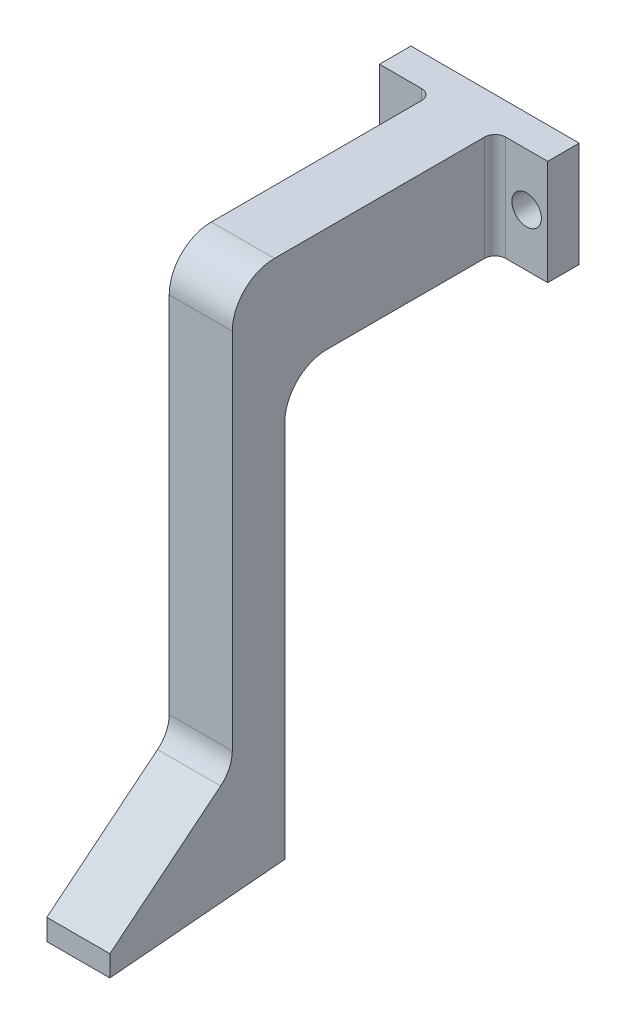
ISO-10303-21;
HEADER;
FILE_DESCRIPTION(('STEP AP214'),'2;1');
FILE_NAME('part.step','',(''),(''),'','','');
FILE_SCHEMA(('AUTOMOTIVE_DESIGN { 1 0 10303 214 1 1 1 1 }'));
ENDSEC;
DATA;
#1=APPLICATION_CONTEXT('core data for automotive mechanical design processes');
#2=APPLICATION_PROTOCOL_DEFINITION('international standard','automotive_design',2000,#1);
#3=PRODUCT_CONTEXT('',#1,'mechanical');
#4=PRODUCT('Part','Part','',(#3));
#5=PRODUCT_RELATED_PRODUCT_CATEGORY('part','',(#4));
#6=PRODUCT_DEFINITION_FORMATION('','',#4);
#7=PRODUCT_DEFINITION_CONTEXT('part definition',#1,'design');
#8=PRODUCT_DEFINITION('design','',#6,#7);
#9=PRODUCT_DEFINITION_SHAPE('','',#8);
#10=(LENGTH_UNIT() NAMED_UNIT(*) SI_UNIT(.MILLI.,.METRE.));
#11=(NAMED_UNIT(*) PLANE_ANGLE_UNIT() SI_UNIT($,.RADIAN.));
#12=(NAMED_UNIT(*) SI_UNIT($,.STERADIAN.) SOLID_ANGLE_UNIT());
#13=UNCERTAINTY_MEASURE_WITH_UNIT(LENGTH_MEASURE(1.E-05),#10,'distance_accuracy_value','');
#14=(GEOMETRIC_REPRESENTATION_CONTEXT(3) GLOBAL_UNCERTAINTY_ASSIGNED_CONTEXT((#13)) GLOBAL_UNIT_ASSIGNED_CONTEXT((#10,
#11,#12)) REPRESENTATION_CONTEXT('',''));
#15=CARTESIAN_POINT('',(0.,0.,0.));
#16=DIRECTION('',(0.,0.,1.));
#17=DIRECTION('',(1.,0.,0.));
#18=AXIS2_PLACEMENT_3D('',#15,#16,#17);
#19=CARTESIAN_POINT('',(0.,0.,3.81));
#20=DIRECTION('',(0.,0.,1.));
#21=DIRECTION('',(1.,0.,0.));
#22=AXIS2_PLACEMENT_3D('',#19,#20,#21);
#23=PLANE('',#22);
#24=DIRECTION('',(-1.,0.,0.));
#25=VECTOR('',#24,1.);
#26=CARTESIAN_POINT('',(-10.16,6.35,3.81));
#27=LINE('',#26,#25);
#28=CARTESIAN_POINT('',(10.16,6.35,3.81));
#29=VERTEX_POINT('',#28);
#30=CARTESIAN_POINT('',(5.08,6.35,3.81));
#31=VERTEX_POINT('',#30);
#32=EDGE_CURVE('E222',#29,#31,#27,.T.);
#33=ORIENTED_EDGE('',*,*,#32,.T.);
#34=DIRECTION('',(0.,1.,0.));
#35=VECTOR('',#34,1.);
#36=CARTESIAN_POINT('',(5.08,0.,3.81));
#37=LINE('',#36,#35);
#38=CARTESIAN_POINT('',(5.08,-6.35,3.81));
#39=VERTEX_POINT('',#38);
#40=EDGE_CURVE('E263',#31,#39,#37,.F.);
#41=ORIENTED_EDGE('',*,*,#40,.T.);
#42=DIRECTION('',(1.,0.,0.));
#43=VECTOR('',#42,1.);
#44=CARTESIAN_POINT('',(-10.16,-6.35,3.81));
#45=LINE('',#44,#43);
#46=CARTESIAN_POINT('',(10.16,-6.35,3.81));
#47=VERTEX_POINT('',#46);
#48=EDGE_CURVE('E227',#39,#47,#45,.T.);
#49=ORIENTED_EDGE('',*,*,#48,.T.);
#50=DIRECTION('',(0.,1.,0.));
#51=VECTOR('',#50,1.);
#52=CARTESIAN_POINT('',(10.16,6.35,3.81));
#53=LINE('',#52,#51);
#54=EDGE_CURVE('E217',#47,#29,#53,.T.);
#55=ORIENTED_EDGE('',*,*,#54,.T.);
#56=EDGE_LOOP('',(#33,#41,#49,#55));
#57=FACE_BOUND('',#56,.T.);
#58=CARTESIAN_POINT('',(7.62,0.,3.81));
#59=DIRECTION('',(0.,0.,1.));
#60=DIRECTION('',(1.,0.,0.));
#61=AXIS2_PLACEMENT_3D('',#58,#59,#60);
#62=CIRCLE('',#61,1.778);
#63=CARTESIAN_POINT('',(9.398,0.,3.81));
#64=VERTEX_POINT('',#63);
#65=EDGE_CURVE('E209',#64,#64,#62,.T.);
#66=ORIENTED_EDGE('',*,*,#65,.F.);
#67=EDGE_LOOP('',(#66));
#68=FACE_BOUND('',#67,.T.);
#69=ADVANCED_FACE('F32',(#57,#68),#23,.T.);
#70=CARTESIAN_POINT('',(10.16,6.35,3.81));
#71=DIRECTION('',(-1.,0.,0.));
#72=DIRECTION('',(0.,-1.,0.));
#73=AXIS2_PLACEMENT_3D('',#70,#71,#72);
#74=PLANE('',#73);
#75=DIRECTION('',(0.,1.,0.));
#76=VECTOR('',#75,1.);
#77=CARTESIAN_POINT('',(10.16,6.35,0.));
#78=LINE('',#77,#76);
#79=CARTESIAN_POINT('',(10.16,-6.35,0.));
#80=VERTEX_POINT('',#79);
#81=CARTESIAN_POINT('',(10.16,6.35,0.));
#82=VERTEX_POINT('',#81);
#83=EDGE_CURVE('E208',#80,#82,#78,.T.);
#84=ORIENTED_EDGE('',*,*,#83,.T.);
#85=DIRECTION('',(0.,0.,-1.));
#86=VECTOR('',#85,1.);
#87=CARTESIAN_POINT('',(10.16,6.35,3.81));
#88=LINE('',#87,#86);
#89=EDGE_CURVE('E247',#29,#82,#88,.T.);
#90=ORIENTED_EDGE('',*,*,#89,.F.);
#91=ORIENTED_EDGE('',*,*,#54,.F.);
#92=DIRECTION('',(0.,0.,-1.));
#93=VECTOR('',#92,1.);
#94=CARTESIAN_POINT('',(10.16,-6.35,3.81));
#95=LINE('',#94,#93);
#96=EDGE_CURVE('E231',#47,#80,#95,.T.);
#97=ORIENTED_EDGE('',*,*,#96,.T.);
#98=EDGE_LOOP('',(#84,#90,#91,#97));
#99=FACE_BOUND('',#98,.T.);
#100=ADVANCED_FACE('F308',(#99),#74,.F.);
#101=CARTESIAN_POINT('',(-10.16,6.35,3.81));
#102=DIRECTION('',(0.,-1.,0.));
#103=DIRECTION('',(0.,0.,-1.));
#104=AXIS2_PLACEMENT_3D('',#101,#102,#103);
#105=PLANE('',#104);
#106=DIRECTION('',(0.,0.,-1.));
#107=VECTOR('',#106,1.);
#108=CARTESIAN_POINT('',(-3.81,6.35,29.21));
#109=LINE('',#108,#107);
#110=CARTESIAN_POINT('',(-3.81,6.35,30.48));
#111=VERTEX_POINT('',#110);
#112=CARTESIAN_POINT('',(-3.81,6.35,5.08));
#113=VERTEX_POINT('',#112);
#114=EDGE_CURVE('E200',#111,#113,#109,.T.);
#115=ORIENTED_EDGE('',*,*,#114,.F.);
#116=DIRECTION('',(-1.,0.,0.));
#117=VECTOR('',#116,1.);
#118=CARTESIAN_POINT('',(3.81,6.35,30.48));
#119=LINE('',#118,#117);
#120=CARTESIAN_POINT('',(3.81,6.35,30.48));
#121=VERTEX_POINT('',#120);
#122=EDGE_CURVE('E282',#111,#121,#119,.F.);
#123=ORIENTED_EDGE('',*,*,#122,.T.);
#124=DIRECTION('',(0.,0.,-1.));
#125=VECTOR('',#124,1.);
#126=CARTESIAN_POINT('',(3.81,6.35,29.21));
#127=LINE('',#126,#125);
#128=CARTESIAN_POINT('',(3.81,6.35,5.08));
#129=VERTEX_POINT('',#128);
#130=EDGE_CURVE('E202',#121,#129,#127,.T.);
#131=ORIENTED_EDGE('',*,*,#130,.T.);
#132=CARTESIAN_POINT('',(5.08,6.35,5.08));
#133=DIRECTION('',(0.,-1.,0.));
#134=DIRECTION('',(0.,0.,-1.));
#135=AXIS2_PLACEMENT_3D('',#132,#133,#134);
#136=CIRCLE('',#135,1.27);
#137=EDGE_CURVE('E265',#129,#31,#136,.T.);
#138=ORIENTED_EDGE('',*,*,#137,.T.);
#139=ORIENTED_EDGE('',*,*,#32,.F.);
#140=ORIENTED_EDGE('',*,*,#89,.T.);
#141=DIRECTION('',(-1.,0.,0.));
#142=VECTOR('',#141,1.);
#143=CARTESIAN_POINT('',(-10.16,6.35,0.));
#144=LINE('',#143,#142);
#145=CARTESIAN_POINT('',(-10.16,6.35,0.));
#146=VERTEX_POINT('',#145);
#147=EDGE_CURVE('E234',#82,#146,#144,.T.);
#148=ORIENTED_EDGE('',*,*,#147,.T.);
#149=DIRECTION('',(0.,0.,-1.));
#150=VECTOR('',#149,1.);
#151=CARTESIAN_POINT('',(-10.16,6.35,3.81));
#152=LINE('',#151,#150);
#153=CARTESIAN_POINT('',(-10.16,6.35,3.81));
#154=VERTEX_POINT('',#153);
#155=EDGE_CURVE('E244',#154,#146,#152,.T.);
#156=ORIENTED_EDGE('',*,*,#155,.F.);
#157=CARTESIAN_POINT('',(-5.08,6.35,3.81));
#158=VERTEX_POINT('',#157);
#159=EDGE_CURVE('E220',#158,#154,#27,.T.);
#160=ORIENTED_EDGE('',*,*,#159,.F.);
#161=CARTESIAN_POINT('',(-5.08,6.35,5.08));
#162=DIRECTION('',(0.,-1.,0.));
#163=DIRECTION('',(0.,0.,-1.));
#164=AXIS2_PLACEMENT_3D('',#161,#162,#163);
#165=CIRCLE('',#164,1.27);
#166=EDGE_CURVE('E257',#158,#113,#165,.T.);
#167=ORIENTED_EDGE('',*,*,#166,.T.);
#168=EDGE_LOOP('',(#115,#123,#131,#138,#139,#140,#148,#156,#160,#167));
#169=FACE_BOUND('',#168,.T.);
#170=ADVANCED_FACE('F315',(#169),#105,.F.);
#171=CARTESIAN_POINT('',(-10.16,6.35,3.81));
#172=DIRECTION('',(1.,0.,0.));
#173=DIRECTION('',(0.,0.,-1.));
#174=AXIS2_PLACEMENT_3D('',#171,#172,#173);
#175=PLANE('',#174);
#176=DIRECTION('',(0.,-1.,0.));
#177=VECTOR('',#176,1.);
#178=CARTESIAN_POINT('',(-10.16,6.35,0.));
#179=LINE('',#178,#177);
#180=CARTESIAN_POINT('',(-10.16,-6.35,0.));
#181=VERTEX_POINT('',#180);
#182=EDGE_CURVE('E236',#146,#181,#179,.T.);
#183=ORIENTED_EDGE('',*,*,#182,.T.);
#184=DIRECTION('',(0.,0.,-1.));
#185=VECTOR('',#184,1.);
#186=CARTESIAN_POINT('',(-10.16,-6.35,3.81));
#187=LINE('',#186,#185);
#188=CARTESIAN_POINT('',(-10.16,-6.35,3.81));
#189=VERTEX_POINT('',#188);
#190=EDGE_CURVE('E241',#189,#181,#187,.T.);
#191=ORIENTED_EDGE('',*,*,#190,.F.);
#192=DIRECTION('',(0.,-1.,0.));
#193=VECTOR('',#192,1.);
#194=CARTESIAN_POINT('',(-10.16,6.35,3.81));
#195=LINE('',#194,#193);
#196=EDGE_CURVE('E225',#154,#189,#195,.T.);
#197=ORIENTED_EDGE('',*,*,#196,.F.);
#198=ORIENTED_EDGE('',*,*,#155,.T.);
#199=EDGE_LOOP('',(#183,#191,#197,#198));
#200=FACE_BOUND('',#199,.T.);
#201=ADVANCED_FACE('F331',(#200),#175,.F.);
#202=CARTESIAN_POINT('',(-10.16,-6.35,3.81));
#203=DIRECTION('',(0.,1.,0.));
#204=DIRECTION('',(0.,0.,1.));
#205=AXIS2_PLACEMENT_3D('',#202,#203,#204);
#206=PLANE('',#205);
#207=DIRECTION('',(0.,0.,-1.));
#208=VECTOR('',#207,1.);
#209=CARTESIAN_POINT('',(3.81,-6.35,29.21));
#210=LINE('',#209,#208);
#211=CARTESIAN_POINT('',(3.81,-6.35,24.13));
#212=VERTEX_POINT('',#211);
#213=CARTESIAN_POINT('',(3.81,-6.35,5.08));
#214=VERTEX_POINT('',#213);
#215=EDGE_CURVE('E195',#212,#214,#210,.T.);
#216=ORIENTED_EDGE('',*,*,#215,.F.);
#217=DIRECTION('',(1.,0.,0.));
#218=VECTOR('',#217,1.);
#219=CARTESIAN_POINT('',(-10.16,-6.35,24.13));
#220=LINE('',#219,#218);
#221=CARTESIAN_POINT('',(-3.81,-6.35,24.13));
#222=VERTEX_POINT('',#221);
#223=EDGE_CURVE('E271',#212,#222,#220,.F.);
#224=ORIENTED_EDGE('',*,*,#223,.T.);
#225=DIRECTION('',(0.,0.,-1.));
#226=VECTOR('',#225,1.);
#227=CARTESIAN_POINT('',(-3.81,-6.35,29.21));
#228=LINE('',#227,#226);
#229=CARTESIAN_POINT('',(-3.81,-6.35,5.08));
#230=VERTEX_POINT('',#229);
#231=EDGE_CURVE('E198',#222,#230,#228,.T.);
#232=ORIENTED_EDGE('',*,*,#231,.T.);
#233=CARTESIAN_POINT('',(-5.08,-6.35,5.08));
#234=DIRECTION('',(0.,1.,0.));
#235=DIRECTION('',(0.,0.,1.));
#236=AXIS2_PLACEMENT_3D('',#233,#234,#235);
#237=CIRCLE('',#236,1.27);
#238=CARTESIAN_POINT('',(-5.08,-6.35,3.81));
#239=VERTEX_POINT('',#238);
#240=EDGE_CURVE('E255',#230,#239,#237,.T.);
#241=ORIENTED_EDGE('',*,*,#240,.T.);
#242=EDGE_CURVE('E228',#189,#239,#45,.T.);
#243=ORIENTED_EDGE('',*,*,#242,.F.);
#244=ORIENTED_EDGE('',*,*,#190,.T.);
#245=DIRECTION('',(1.,0.,0.));
#246=VECTOR('',#245,1.);
#247=CARTESIAN_POINT('',(-10.16,-6.35,0.));
#248=LINE('',#247,#246);
#249=EDGE_CURVE('E221',#181,#80,#248,.T.);
#250=ORIENTED_EDGE('',*,*,#249,.T.);
#251=ORIENTED_EDGE('',*,*,#96,.F.);
#252=ORIENTED_EDGE('',*,*,#48,.F.);
#253=CARTESIAN_POINT('',(5.08,-6.35,5.08));
#254=DIRECTION('',(0.,1.,0.));
#255=DIRECTION('',(0.,0.,1.));
#256=AXIS2_PLACEMENT_3D('',#253,#254,#255);
#257=CIRCLE('',#256,1.27);
#258=EDGE_CURVE('E267',#39,#214,#257,.T.);
#259=ORIENTED_EDGE('',*,*,#258,.T.);
#260=EDGE_LOOP('',(#216,#224,#232,#241,#243,#244,#250,#251,#252,#259));
#261=FACE_BOUND('',#260,.T.);
#262=ADVANCED_FACE('F323',(#261),#206,.F.);
#263=ORIENTED_EDGE('',*,*,#242,.T.);
#264=DIRECTION('',(0.,-1.,0.));
#265=VECTOR('',#264,1.);
#266=CARTESIAN_POINT('',(-5.08,0.,3.81));
#267=LINE('',#266,#265);
#268=EDGE_CURVE('E253',#239,#158,#267,.F.);
#269=ORIENTED_EDGE('',*,*,#268,.T.);
#270=ORIENTED_EDGE('',*,*,#159,.T.);
#271=ORIENTED_EDGE('',*,*,#196,.T.);
#272=EDGE_LOOP('',(#263,#269,#270,#271));
#273=FACE_BOUND('',#272,.T.);
#274=CARTESIAN_POINT('',(-7.62,0.,3.81));
#275=DIRECTION('',(0.,0.,1.));
#276=DIRECTION('',(1.,0.,0.));
#277=AXIS2_PLACEMENT_3D('',#274,#275,#276);
#278=CIRCLE('',#277,1.778);
#279=CARTESIAN_POINT('',(-5.842,0.,3.81));
#280=VERTEX_POINT('',#279);
#281=EDGE_CURVE('E212',#280,#280,#278,.T.);
#282=ORIENTED_EDGE('',*,*,#281,.F.);
#283=EDGE_LOOP('',(#282));
#284=FACE_BOUND('',#283,.T.);
#285=ADVANCED_FACE('F311',(#273,#284),#23,.T.);
#286=CARTESIAN_POINT('',(0.,0.,0.));
#287=DIRECTION('',(0.,0.,1.));
#288=DIRECTION('',(1.,0.,0.));
#289=AXIS2_PLACEMENT_3D('',#286,#287,#288);
#290=PLANE('',#289);
#291=CARTESIAN_POINT('',(7.62,0.,0.));
#292=DIRECTION('',(0.,0.,1.));
#293=DIRECTION('',(1.,0.,0.));
#294=AXIS2_PLACEMENT_3D('',#291,#292,#293);
#295=CIRCLE('',#294,1.778);
#296=CARTESIAN_POINT('',(9.398,0.,0.));
#297=VERTEX_POINT('',#296);
#298=EDGE_CURVE('E205',#297,#297,#295,.T.);
#299=ORIENTED_EDGE('',*,*,#298,.T.);
#300=EDGE_LOOP('',(#299));
#301=FACE_BOUND('',#300,.T.);
#302=CARTESIAN_POINT('',(-7.62,0.,0.));
#303=DIRECTION('',(0.,0.,1.));
#304=DIRECTION('',(1.,0.,0.));
#305=AXIS2_PLACEMENT_3D('',#302,#303,#304);
#306=CIRCLE('',#305,1.778);
#307=CARTESIAN_POINT('',(-5.842,0.,0.));
#308=VERTEX_POINT('',#307);
#309=EDGE_CURVE('E204',#308,#308,#306,.T.);
#310=ORIENTED_EDGE('',*,*,#309,.T.);
#311=EDGE_LOOP('',(#310));
#312=FACE_BOUND('',#311,.T.);
#313=ORIENTED_EDGE('',*,*,#83,.F.);
#314=ORIENTED_EDGE('',*,*,#249,.F.);
#315=ORIENTED_EDGE('',*,*,#182,.F.);
#316=ORIENTED_EDGE('',*,*,#147,.F.);
#317=EDGE_LOOP('',(#313,#314,#315,#316));
#318=FACE_BOUND('',#317,.T.);
#319=ADVANCED_FACE('F322',(#301,#312,#318),#290,.F.);
#320=CARTESIAN_POINT('',(-7.62,0.,0.));
#321=DIRECTION('',(0.,0.,1.));
#322=DIRECTION('',(1.,0.,0.));
#323=AXIS2_PLACEMENT_3D('',#320,#321,#322);
#324=CYLINDRICAL_SURFACE('',#323,1.778);
#325=CARTESIAN_POINT('',(-5.842,0.,0.));
#326=CARTESIAN_POINT('',(-5.842,0.,0.0396874999999999));
#327=CARTESIAN_POINT('',(-5.842,0.,0.079375));
#328=CARTESIAN_POINT('',(-5.842,0.,0.15875));
#329=CARTESIAN_POINT('',(-5.842,0.,0.1984375));
#330=CARTESIAN_POINT('',(-5.842,0.,0.2778125));
#331=CARTESIAN_POINT('',(-5.842,0.,0.3175));
#332=CARTESIAN_POINT('',(-5.842,0.,0.396875));
#333=CARTESIAN_POINT('',(-5.842,0.,0.4365625));
#334=CARTESIAN_POINT('',(-5.842,0.,0.5159375));
#335=CARTESIAN_POINT('',(-5.842,0.,0.555625));
#336=CARTESIAN_POINT('',(-5.842,0.,0.635));
#337=CARTESIAN_POINT('',(-5.842,0.,0.6746875));
#338=CARTESIAN_POINT('',(-5.842,0.,0.7540625));
#339=CARTESIAN_POINT('',(-5.842,0.,0.79375));
#340=CARTESIAN_POINT('',(-5.842,0.,0.873125));
#341=CARTESIAN_POINT('',(-5.842,0.,0.9128125));
#342=CARTESIAN_POINT('',(-5.842,0.,0.9921875));
#343=CARTESIAN_POINT('',(-5.842,0.,1.031875));
#344=CARTESIAN_POINT('',(-5.842,0.,1.11125));
#345=CARTESIAN_POINT('',(-5.842,0.,1.1509375));
#346=CARTESIAN_POINT('',(-5.842,0.,1.2303125));
#347=CARTESIAN_POINT('',(-5.842,0.,1.27));
#348=CARTESIAN_POINT('',(-5.842,0.,1.349375));
#349=CARTESIAN_POINT('',(-5.842,0.,1.3890625));
#350=CARTESIAN_POINT('',(-5.842,0.,1.4684375));
#351=CARTESIAN_POINT('',(-5.842,0.,1.508125));
#352=CARTESIAN_POINT('',(-5.842,0.,1.5875));
#353=CARTESIAN_POINT('',(-5.842,0.,1.6271875));
#354=CARTESIAN_POINT('',(-5.842,0.,1.7065625));
#355=CARTESIAN_POINT('',(-5.842,0.,1.74625));
#356=CARTESIAN_POINT('',(-5.842,0.,1.825625));
#357=CARTESIAN_POINT('',(-5.842,0.,1.8653125));
#358=CARTESIAN_POINT('',(-5.842,0.,1.9446875));
#359=CARTESIAN_POINT('',(-5.842,0.,1.984375));
#360=CARTESIAN_POINT('',(-5.842,0.,2.06375));
#361=CARTESIAN_POINT('',(-5.842,0.,2.1034375));
#362=CARTESIAN_POINT('',(-5.842,0.,2.1828125));
#363=CARTESIAN_POINT('',(-5.842,0.,2.2225));
#364=CARTESIAN_POINT('',(-5.842,0.,2.301875));
#365=CARTESIAN_POINT('',(-5.842,0.,2.3415625));
#366=CARTESIAN_POINT('',(-5.842,0.,2.4209375));
#367=CARTESIAN_POINT('',(-5.842,0.,2.460625));
#368=CARTESIAN_POINT('',(-5.842,0.,2.54));
#369=CARTESIAN_POINT('',(-5.842,0.,2.5796875));
#370=CARTESIAN_POINT('',(-5.842,0.,2.6590625));
#371=CARTESIAN_POINT('',(-5.842,0.,2.69875));
#372=CARTESIAN_POINT('',(-5.842,0.,2.778125));
#373=CARTESIAN_POINT('',(-5.842,0.,2.8178125));
#374=CARTESIAN_POINT('',(-5.842,0.,2.8971875));
#375=CARTESIAN_POINT('',(-5.842,0.,2.936875));
#376=CARTESIAN_POINT('',(-5.842,0.,3.01625));
#377=CARTESIAN_POINT('',(-5.842,0.,3.0559375));
#378=CARTESIAN_POINT('',(-5.842,0.,3.1353125));
#379=CARTESIAN_POINT('',(-5.842,0.,3.175));
#380=CARTESIAN_POINT('',(-5.842,0.,3.254375));
#381=CARTESIAN_POINT('',(-5.842,0.,3.2940625));
#382=CARTESIAN_POINT('',(-5.842,0.,3.3734375));
#383=CARTESIAN_POINT('',(-5.842,0.,3.413125));
#384=CARTESIAN_POINT('',(-5.842,0.,3.4925));
#385=CARTESIAN_POINT('',(-5.842,0.,3.5321875));
#386=CARTESIAN_POINT('',(-5.842,0.,3.6115625));
#387=CARTESIAN_POINT('',(-5.842,0.,3.65125));
#388=CARTESIAN_POINT('',(-5.842,0.,3.730625));
#389=CARTESIAN_POINT('',(-5.842,0.,3.7703125));
#390=CARTESIAN_POINT('',(-5.842,0.,3.81));
#391=B_SPLINE_CURVE_WITH_KNOTS('',3,(#325,#326,#327,#328,#329,#330,#331,#332,#333,#334,#335,
#336,#337,#338,#339,#340,#341,#342,#343,#344,#345,#346,#347,#348,#349,#350,#351,#352,#353,#354,
#355,#356,#357,#358,#359,#360,#361,#362,#363,#364,#365,#366,#367,#368,#369,#370,#371,#372,#373,
#374,#375,#376,#377,#378,#379,#380,#381,#382,#383,#384,#385,#386,#387,#388,#389,#390),
.UNSPECIFIED.,.F.,.F.,(4,2,2,2,2,2,2,2,2,2,2,2,2,2,2,2,2,2,2,2,2,2,2,2,2,2,2,2,2,2,2,2,4),(0.,
0.1190625,0.238125,0.3571875,0.47625,0.5953125,0.714375,0.8334375,0.9525,1.0715625,1.190625,
1.3096875,1.42875,1.5478125,1.666875,1.7859375,1.905,2.0240625,2.143125,2.2621875,2.38125,
2.5003125,2.619375,2.7384375,2.8575,2.9765625,3.095625,3.2146875,3.33375,3.4528125,3.571875,
3.6909375,3.81),.UNSPECIFIED.);
#392=EDGE_CURVE('BSEAM329',#308,#280,#391,.T.);
#393=ORIENTED_EDGE('',*,*,#309,.F.);
#394=ORIENTED_EDGE('',*,*,#281,.T.);
#395=ORIENTED_EDGE('',*,*,#392,.T.);
#396=ORIENTED_EDGE('',*,*,#392,.F.);
#397=EDGE_LOOP('',(#393,#395,#394,#396));
#398=FACE_BOUND('',#397,.T.);
#399=ADVANCED_FACE('F329',(#398),#324,.F.);
#400=CARTESIAN_POINT('',(7.62,0.,0.));
#401=DIRECTION('',(0.,0.,1.));
#402=DIRECTION('',(1.,0.,0.));
#403=AXIS2_PLACEMENT_3D('',#400,#401,#402);
#404=CYLINDRICAL_SURFACE('',#403,1.778);
#405=CARTESIAN_POINT('',(9.398,0.,0.));
#406=CARTESIAN_POINT('',(9.398,0.,0.0396874999999999));
#407=CARTESIAN_POINT('',(9.398,0.,0.079375));
#408=CARTESIAN_POINT('',(9.398,0.,0.15875));
#409=CARTESIAN_POINT('',(9.398,0.,0.1984375));
#410=CARTESIAN_POINT('',(9.398,0.,0.2778125));
#411=CARTESIAN_POINT('',(9.398,0.,0.3175));
#412=CARTESIAN_POINT('',(9.398,0.,0.396875));
#413=CARTESIAN_POINT('',(9.398,0.,0.4365625));
#414=CARTESIAN_POINT('',(9.398,0.,0.5159375));
#415=CARTESIAN_POINT('',(9.398,0.,0.555625));
#416=CARTESIAN_POINT('',(9.398,0.,0.635));
#417=CARTESIAN_POINT('',(9.398,0.,0.6746875));
#418=CARTESIAN_POINT('',(9.398,0.,0.7540625));
#419=CARTESIAN_POINT('',(9.398,0.,0.79375));
#420=CARTESIAN_POINT('',(9.398,0.,0.873125));
#421=CARTESIAN_POINT('',(9.398,0.,0.9128125));
#422=CARTESIAN_POINT('',(9.398,0.,0.9921875));
#423=CARTESIAN_POINT('',(9.398,0.,1.031875));
#424=CARTESIAN_POINT('',(9.398,0.,1.11125));
#425=CARTESIAN_POINT('',(9.398,0.,1.1509375));
#426=CARTESIAN_POINT('',(9.398,0.,1.2303125));
#427=CARTESIAN_POINT('',(9.398,0.,1.27));
#428=CARTESIAN_POINT('',(9.398,0.,1.349375));
#429=CARTESIAN_POINT('',(9.398,0.,1.3890625));
#430=CARTESIAN_POINT('',(9.398,0.,1.4684375));
#431=CARTESIAN_POINT('',(9.398,0.,1.508125));
#432=CARTESIAN_POINT('',(9.398,0.,1.5875));
#433=CARTESIAN_POINT('',(9.398,0.,1.6271875));
#434=CARTESIAN_POINT('',(9.398,0.,1.7065625));
#435=CARTESIAN_POINT('',(9.398,0.,1.74625));
#436=CARTESIAN_POINT('',(9.398,0.,1.825625));
#437=CARTESIAN_POINT('',(9.398,0.,1.8653125));
#438=CARTESIAN_POINT('',(9.398,0.,1.9446875));
#439=CARTESIAN_POINT('',(9.398,0.,1.984375));
#440=CARTESIAN_POINT('',(9.398,0.,2.06375));
#441=CARTESIAN_POINT('',(9.398,0.,2.1034375));
#442=CARTESIAN_POINT('',(9.398,0.,2.1828125));
#443=CARTESIAN_POINT('',(9.398,0.,2.2225));
#444=CARTESIAN_POINT('',(9.398,0.,2.301875));
#445=CARTESIAN_POINT('',(9.398,0.,2.3415625));
#446=CARTESIAN_POINT('',(9.398,0.,2.4209375));
#447=CARTESIAN_POINT('',(9.398,0.,2.460625));
#448=CARTESIAN_POINT('',(9.398,0.,2.54));
#449=CARTESIAN_POINT('',(9.398,0.,2.5796875));
#450=CARTESIAN_POINT('',(9.398,0.,2.6590625));
#451=CARTESIAN_POINT('',(9.398,0.,2.69875));
#452=CARTESIAN_POINT('',(9.398,0.,2.778125));
#453=CARTESIAN_POINT('',(9.398,0.,2.8178125));
#454=CARTESIAN_POINT('',(9.398,0.,2.8971875));
#455=CARTESIAN_POINT('',(9.398,0.,2.936875));
#456=CARTESIAN_POINT('',(9.398,0.,3.01625));
#457=CARTESIAN_POINT('',(9.398,0.,3.0559375));
#458=CARTESIAN_POINT('',(9.398,0.,3.1353125));
#459=CARTESIAN_POINT('',(9.398,0.,3.175));
#460=CARTESIAN_POINT('',(9.398,0.,3.254375));
#461=CARTESIAN_POINT('',(9.398,0.,3.2940625));
#462=CARTESIAN_POINT('',(9.398,0.,3.3734375));
#463=CARTESIAN_POINT('',(9.398,0.,3.413125));
#464=CARTESIAN_POINT('',(9.398,0.,3.4925));
#465=CARTESIAN_POINT('',(9.398,0.,3.5321875));
#466=CARTESIAN_POINT('',(9.398,0.,3.6115625));
#467=CARTESIAN_POINT('',(9.398,0.,3.65125));
#468=CARTESIAN_POINT('',(9.398,0.,3.730625));
#469=CARTESIAN_POINT('',(9.398,0.,3.7703125));
#470=CARTESIAN_POINT('',(9.398,0.,3.81));
#471=B_SPLINE_CURVE_WITH_KNOTS('',3,(#405,#406,#407,#408,#409,#410,#411,#412,#413,#414,#415,
#416,#417,#418,#419,#420,#421,#422,#423,#424,#425,#426,#427,#428,#429,#430,#431,#432,#433,#434,
#435,#436,#437,#438,#439,#440,#441,#442,#443,#444,#445,#446,#447,#448,#449,#450,#451,#452,#453,
#454,#455,#456,#457,#458,#459,#460,#461,#462,#463,#464,#465,#466,#467,#468,#469,#470),
.UNSPECIFIED.,.F.,.F.,(4,2,2,2,2,2,2,2,2,2,2,2,2,2,2,2,2,2,2,2,2,2,2,2,2,2,2,2,2,2,2,2,4),(0.,
0.1190625,0.238125,0.3571875,0.47625,0.5953125,0.714375,0.8334375,0.9525,1.0715625,1.190625,
1.3096875,1.42875,1.5478125,1.666875,1.7859375,1.905,2.0240625,2.143125,2.2621875,2.38125,
2.5003125,2.619375,2.7384375,2.8575,2.9765625,3.095625,3.2146875,3.33375,3.4528125,3.571875,
3.6909375,3.81),.UNSPECIFIED.);
#472=EDGE_CURVE('BSEAM340',#297,#64,#471,.T.);
#473=ORIENTED_EDGE('',*,*,#298,.F.);
#474=ORIENTED_EDGE('',*,*,#65,.T.);
#475=ORIENTED_EDGE('',*,*,#472,.T.);
#476=ORIENTED_EDGE('',*,*,#472,.F.);
#477=EDGE_LOOP('',(#473,#475,#474,#476));
#478=FACE_BOUND('',#477,.T.);
#479=ADVANCED_FACE('F340',(#478),#404,.F.);
#480=CARTESIAN_POINT('',(3.81,-6.35,29.21));
#481=DIRECTION('',(-1.,0.,0.));
#482=DIRECTION('',(0.,0.,1.));
#483=AXIS2_PLACEMENT_3D('',#480,#481,#482);
#484=PLANE('',#483);
#485=ORIENTED_EDGE('',*,*,#130,.F.);
#486=CARTESIAN_POINT('',(3.81,1.26999999999999,30.48));
#487=DIRECTION('',(-1.,0.,0.));
#488=DIRECTION('',(0.,0.,1.));
#489=AXIS2_PLACEMENT_3D('',#486,#487,#488);
#490=CIRCLE('',#489,5.08);
#491=CARTESIAN_POINT('',(3.81,1.26999999999999,35.56));
#492=VERTEX_POINT('',#491);
#493=EDGE_CURVE('E284',#121,#492,#490,.F.);
#494=ORIENTED_EDGE('',*,*,#493,.T.);
#495=DIRECTION('',(0.,1.,0.));
#496=VECTOR('',#495,1.);
#497=CARTESIAN_POINT('',(3.81,-44.45,35.56));
#498=LINE('',#497,#496);
#499=CARTESIAN_POINT('',(3.81,-42.6360036321597,35.56));
#500=VERTEX_POINT('',#499);
#501=EDGE_CURVE('E169',#500,#492,#498,.T.);
#502=ORIENTED_EDGE('',*,*,#501,.F.);
#503=CARTESIAN_POINT('',(3.81,-42.6360036321597,39.37));
#504=DIRECTION('',(-1.,0.,0.));
#505=DIRECTION('',(0.,0.,1.));
#506=AXIS2_PLACEMENT_3D('',#503,#504,#505);
#507=CIRCLE('',#506,3.81);
#508=CARTESIAN_POINT('',(3.81,-45.5935620878961,36.9681365607299));
#509=VERTEX_POINT('',#508);
#510=EDGE_CURVE('E11',#500,#509,#507,.T.);
#511=ORIENTED_EDGE('',*,*,#510,.T.);
#512=DIRECTION('',(0.,0.630410351514456,-0.776262061873063));
#513=VECTOR('',#512,1.);
#514=CARTESIAN_POINT('',(3.81,-56.4593171963504,50.3477922786819));
#515=LINE('',#514,#513);
#516=CARTESIAN_POINT('',(3.81,-56.4593171963504,50.3477922786819));
#517=VERTEX_POINT('',#516);
#518=EDGE_CURVE('E178',#517,#509,#515,.T.);
#519=ORIENTED_EDGE('',*,*,#518,.F.);
#520=DIRECTION('',(0.,1.,0.));
#521=VECTOR('',#520,1.);
#522=CARTESIAN_POINT('',(3.81,-58.9993171963504,50.3477922786819));
#523=LINE('',#522,#521);
#524=CARTESIAN_POINT('',(3.81,-58.9993171963504,50.3477922786819));
#525=VERTEX_POINT('',#524);
#526=EDGE_CURVE('E176',#525,#517,#523,.T.);
#527=ORIENTED_EDGE('',*,*,#526,.F.);
#528=DIRECTION('',(0.,-0.0871557427476544,0.996194698091746));
#529=VECTOR('',#528,1.);
#530=CARTESIAN_POINT('',(3.81,-57.15,29.21));
#531=LINE('',#530,#529);
#532=CARTESIAN_POINT('',(3.81,-57.15,29.21));
#533=VERTEX_POINT('',#532);
#534=EDGE_CURVE('E160',#533,#525,#531,.T.);
#535=ORIENTED_EDGE('',*,*,#534,.F.);
#536=DIRECTION('',(0.,-1.,0.));
#537=VECTOR('',#536,1.);
#538=CARTESIAN_POINT('',(3.81,6.35,29.21));
#539=LINE('',#538,#537);
#540=CARTESIAN_POINT('',(3.81,-11.43,29.21));
#541=VERTEX_POINT('',#540);
#542=EDGE_CURVE('E150',#541,#533,#539,.T.);
#543=ORIENTED_EDGE('',*,*,#542,.F.);
#544=CARTESIAN_POINT('',(3.81,-11.43,24.13));
#545=DIRECTION('',(-1.,0.,0.));
#546=DIRECTION('',(0.,0.,1.));
#547=AXIS2_PLACEMENT_3D('',#544,#545,#546);
#548=CIRCLE('',#547,5.08);
#549=EDGE_CURVE('E273',#541,#212,#548,.T.);
#550=ORIENTED_EDGE('',*,*,#549,.T.);
#551=ORIENTED_EDGE('',*,*,#215,.T.);
#552=DIRECTION('',(0.,1.,0.));
#553=VECTOR('',#552,1.);
#554=CARTESIAN_POINT('',(3.81,-6.35,5.08));
#555=LINE('',#554,#553);
#556=EDGE_CURVE('E260',#214,#129,#555,.T.);
#557=ORIENTED_EDGE('',*,*,#556,.T.);
#558=EDGE_LOOP('',(#485,#494,#502,#511,#519,#527,#535,#543,#550,#551,#557));
#559=FACE_BOUND('',#558,.T.);
#560=ADVANCED_FACE('F173',(#559),#484,.F.);
#561=CARTESIAN_POINT('',(-3.81,-6.35,29.21));
#562=DIRECTION('',(1.,0.,0.));
#563=DIRECTION('',(0.,0.,-1.));
#564=AXIS2_PLACEMENT_3D('',#561,#562,#563);
#565=PLANE('',#564);
#566=DIRECTION('',(0.,0.630410351514456,-0.776262061873063));
#567=VECTOR('',#566,1.);
#568=CARTESIAN_POINT('',(-3.81,-56.4593171963504,50.3477922786819));
#569=LINE('',#568,#567);
#570=CARTESIAN_POINT('',(-3.81,-56.4593171963504,50.3477922786819));
#571=VERTEX_POINT('',#570);
#572=CARTESIAN_POINT('',(-3.81,-45.5935620878961,36.9681365607299));
#573=VERTEX_POINT('',#572);
#574=EDGE_CURVE('E190',#571,#573,#569,.T.);
#575=ORIENTED_EDGE('',*,*,#574,.T.);
#576=CARTESIAN_POINT('',(-3.81,-42.6360036321597,39.37));
#577=DIRECTION('',(1.,0.,0.));
#578=DIRECTION('',(0.,0.,-1.));
#579=AXIS2_PLACEMENT_3D('',#576,#577,#578);
#580=CIRCLE('',#579,3.81);
#581=CARTESIAN_POINT('',(-3.81,-42.6360036321597,35.56));
#582=VERTEX_POINT('',#581);
#583=EDGE_CURVE('E40',#573,#582,#580,.T.);
#584=ORIENTED_EDGE('',*,*,#583,.T.);
#585=DIRECTION('',(0.,1.,0.));
#586=VECTOR('',#585,1.);
#587=CARTESIAN_POINT('',(-3.81,-44.45,35.56));
#588=LINE('',#587,#586);
#589=CARTESIAN_POINT('',(-3.81,1.26999999999999,35.56));
#590=VERTEX_POINT('',#589);
#591=EDGE_CURVE('E161',#582,#590,#588,.T.);
#592=ORIENTED_EDGE('',*,*,#591,.T.);
#593=CARTESIAN_POINT('',(-3.81,1.26999999999999,30.48));
#594=DIRECTION('',(1.,0.,0.));
#595=DIRECTION('',(0.,0.,-1.));
#596=AXIS2_PLACEMENT_3D('',#593,#594,#595);
#597=CIRCLE('',#596,5.08);
#598=EDGE_CURVE('E280',#590,#111,#597,.F.);
#599=ORIENTED_EDGE('',*,*,#598,.T.);
#600=ORIENTED_EDGE('',*,*,#114,.T.);
#601=DIRECTION('',(0.,-1.,0.));
#602=VECTOR('',#601,1.);
#603=CARTESIAN_POINT('',(-3.81,-6.35,5.08));
#604=LINE('',#603,#602);
#605=EDGE_CURVE('E250',#113,#230,#604,.T.);
#606=ORIENTED_EDGE('',*,*,#605,.T.);
#607=ORIENTED_EDGE('',*,*,#231,.F.);
#608=CARTESIAN_POINT('',(-3.81,-11.43,24.13));
#609=DIRECTION('',(1.,0.,0.));
#610=DIRECTION('',(0.,0.,-1.));
#611=AXIS2_PLACEMENT_3D('',#608,#609,#610);
#612=CIRCLE('',#611,5.08);
#613=CARTESIAN_POINT('',(-3.81,-11.43,29.21));
#614=VERTEX_POINT('',#613);
#615=EDGE_CURVE('E275',#222,#614,#612,.T.);
#616=ORIENTED_EDGE('',*,*,#615,.T.);
#617=DIRECTION('',(0.,-1.,0.));
#618=VECTOR('',#617,1.);
#619=CARTESIAN_POINT('',(-3.81,6.35,29.21));
#620=LINE('',#619,#618);
#621=CARTESIAN_POINT('',(-3.81,-57.15,29.21));
#622=VERTEX_POINT('',#621);
#623=EDGE_CURVE('E184',#614,#622,#620,.T.);
#624=ORIENTED_EDGE('',*,*,#623,.T.);
#625=DIRECTION('',(0.,-0.0871557427476544,0.996194698091746));
#626=VECTOR('',#625,1.);
#627=CARTESIAN_POINT('',(-3.81,-57.15,29.21));
#628=LINE('',#627,#626);
#629=CARTESIAN_POINT('',(-3.81,-58.9993171963504,50.3477922786819));
#630=VERTEX_POINT('',#629);
#631=EDGE_CURVE('E167',#622,#630,#628,.T.);
#632=ORIENTED_EDGE('',*,*,#631,.T.);
#633=DIRECTION('',(0.,1.,0.));
#634=VECTOR('',#633,1.);
#635=CARTESIAN_POINT('',(-3.81,-58.9993171963504,50.3477922786819));
#636=LINE('',#635,#634);
#637=EDGE_CURVE('E187',#630,#571,#636,.T.);
#638=ORIENTED_EDGE('',*,*,#637,.T.);
#639=EDGE_LOOP('',(#575,#584,#592,#599,#600,#606,#607,#616,#624,#632,#638));
#640=FACE_BOUND('',#639,.T.);
#641=ADVANCED_FACE('F296',(#640),#565,.F.);
#642=CARTESIAN_POINT('',(-5.08,-6.35,5.08));
#643=DIRECTION('',(0.,-1.,0.));
#644=DIRECTION('',(0.,0.,-1.));
#645=AXIS2_PLACEMENT_3D('',#642,#643,#644);
#646=CYLINDRICAL_SURFACE('',#645,1.27);
#647=ORIENTED_EDGE('',*,*,#166,.F.);
#648=ORIENTED_EDGE('',*,*,#268,.F.);
#649=ORIENTED_EDGE('',*,*,#240,.F.);
#650=ORIENTED_EDGE('',*,*,#605,.F.);
#651=EDGE_LOOP('',(#647,#648,#649,#650));
#652=FACE_BOUND('',#651,.T.);
#653=ADVANCED_FACE('F353',(#652),#646,.F.);
#654=CARTESIAN_POINT('',(5.08,-6.35,5.08));
#655=DIRECTION('',(0.,1.,0.));
#656=DIRECTION('',(0.,0.,1.));
#657=AXIS2_PLACEMENT_3D('',#654,#655,#656);
#658=CYLINDRICAL_SURFACE('',#657,1.27);
#659=ORIENTED_EDGE('',*,*,#258,.F.);
#660=ORIENTED_EDGE('',*,*,#40,.F.);
#661=ORIENTED_EDGE('',*,*,#137,.F.);
#662=ORIENTED_EDGE('',*,*,#556,.F.);
#663=EDGE_LOOP('',(#659,#660,#661,#662));
#664=FACE_BOUND('',#663,.T.);
#665=ADVANCED_FACE('F364',(#664),#658,.F.);
#666=CARTESIAN_POINT('',(3.81,-44.45,35.56));
#667=DIRECTION('',(0.,0.,1.));
#668=DIRECTION('',(1.,0.,0.));
#669=AXIS2_PLACEMENT_3D('',#666,#667,#668);
#670=PLANE('',#669);
#671=ORIENTED_EDGE('',*,*,#591,.F.);
#672=DIRECTION('',(-1.,0.,0.));
#673=VECTOR('',#672,1.);
#674=CARTESIAN_POINT('',(3.81,-42.6360036321597,35.56));
#675=LINE('',#674,#673);
#676=EDGE_CURVE('E53',#582,#500,#675,.F.);
#677=ORIENTED_EDGE('',*,*,#676,.T.);
#678=ORIENTED_EDGE('',*,*,#501,.T.);
#679=DIRECTION('',(-1.,0.,0.));
#680=VECTOR('',#679,1.);
#681=CARTESIAN_POINT('',(-3.81,1.26999999999999,35.56));
#682=LINE('',#681,#680);
#683=EDGE_CURVE('E277',#492,#590,#682,.T.);
#684=ORIENTED_EDGE('',*,*,#683,.T.);
#685=EDGE_LOOP('',(#671,#677,#678,#684));
#686=FACE_BOUND('',#685,.T.);
#687=ADVANCED_FACE('F362',(#686),#670,.T.);
#688=CARTESIAN_POINT('',(3.81,-56.4593171963504,50.3477922786819));
#689=DIRECTION('',(0.,0.776262061873063,0.630410351514456));
#690=DIRECTION('',(0.,-0.630410351514456,0.776262061873063));
#691=AXIS2_PLACEMENT_3D('',#688,#689,#690);
#692=PLANE('',#691);
#693=ORIENTED_EDGE('',*,*,#518,.T.);
#694=DIRECTION('',(-1.,0.,0.));
#695=VECTOR('',#694,1.);
#696=CARTESIAN_POINT('',(-3.81,-45.5935620878961,36.9681365607299));
#697=LINE('',#696,#695);
#698=EDGE_CURVE('E287',#509,#573,#697,.T.);
#699=ORIENTED_EDGE('',*,*,#698,.T.);
#700=ORIENTED_EDGE('',*,*,#574,.F.);
#701=DIRECTION('',(-1.,0.,0.));
#702=VECTOR('',#701,1.);
#703=CARTESIAN_POINT('',(3.81,-56.4593171963504,50.3477922786819));
#704=LINE('',#703,#702);
#705=EDGE_CURVE('E193',#517,#571,#704,.T.);
#706=ORIENTED_EDGE('',*,*,#705,.F.);
#707=EDGE_LOOP('',(#693,#699,#700,#706));
#708=FACE_BOUND('',#707,.T.);
#709=ADVANCED_FACE('F293',(#708),#692,.T.);
#710=CARTESIAN_POINT('',(3.81,-58.9993171963504,50.3477922786819));
#711=DIRECTION('',(0.,0.,1.));
#712=DIRECTION('',(1.,0.,0.));
#713=AXIS2_PLACEMENT_3D('',#710,#711,#712);
#714=PLANE('',#713);
#715=ORIENTED_EDGE('',*,*,#637,.F.);
#716=DIRECTION('',(-1.,0.,0.));
#717=VECTOR('',#716,1.);
#718=CARTESIAN_POINT('',(3.81,-58.9993171963504,50.3477922786819));
#719=LINE('',#718,#717);
#720=EDGE_CURVE('E168',#525,#630,#719,.T.);
#721=ORIENTED_EDGE('',*,*,#720,.F.);
#722=ORIENTED_EDGE('',*,*,#526,.T.);
#723=ORIENTED_EDGE('',*,*,#705,.T.);
#724=EDGE_LOOP('',(#715,#721,#722,#723));
#725=FACE_BOUND('',#724,.T.);
#726=ADVANCED_FACE('F299',(#725),#714,.T.);
#727=CARTESIAN_POINT('',(3.81,-57.15,29.21));
#728=DIRECTION('',(0.,-0.996194698091746,-0.0871557427476544));
#729=DIRECTION('',(0.,0.0871557427476544,-0.996194698091746));
#730=AXIS2_PLACEMENT_3D('',#727,#728,#729);
#731=PLANE('',#730);
#732=ORIENTED_EDGE('',*,*,#631,.F.);
#733=DIRECTION('',(-1.,0.,0.));
#734=VECTOR('',#733,1.);
#735=CARTESIAN_POINT('',(3.81,-57.15,29.21));
#736=LINE('',#735,#734);
#737=EDGE_CURVE('E154',#533,#622,#736,.T.);
#738=ORIENTED_EDGE('',*,*,#737,.F.);
#739=ORIENTED_EDGE('',*,*,#534,.T.);
#740=ORIENTED_EDGE('',*,*,#720,.T.);
#741=EDGE_LOOP('',(#732,#738,#739,#740));
#742=FACE_BOUND('',#741,.T.);
#743=ADVANCED_FACE('F165',(#742),#731,.T.);
#744=CARTESIAN_POINT('',(3.81,6.35,29.21));
#745=DIRECTION('',(0.,0.,-1.));
#746=DIRECTION('',(0.,1.,0.));
#747=AXIS2_PLACEMENT_3D('',#744,#745,#746);
#748=PLANE('',#747);
#749=ORIENTED_EDGE('',*,*,#623,.F.);
#750=DIRECTION('',(1.,0.,0.));
#751=VECTOR('',#750,1.);
#752=CARTESIAN_POINT('',(3.81,-11.43,29.21));
#753=LINE('',#752,#751);
#754=EDGE_CURVE('E157',#614,#541,#753,.T.);
#755=ORIENTED_EDGE('',*,*,#754,.T.);
#756=ORIENTED_EDGE('',*,*,#542,.T.);
#757=ORIENTED_EDGE('',*,*,#737,.T.);
#758=EDGE_LOOP('',(#749,#755,#756,#757));
#759=FACE_BOUND('',#758,.T.);
#760=ADVANCED_FACE('F153',(#759),#748,.T.);
#761=CARTESIAN_POINT('',(3.81,-11.43,24.13));
#762=DIRECTION('',(1.,0.,0.));
#763=DIRECTION('',(0.,0.,-1.));
#764=AXIS2_PLACEMENT_3D('',#761,#762,#763);
#765=CYLINDRICAL_SURFACE('',#764,5.08);
#766=ORIENTED_EDGE('',*,*,#615,.F.);
#767=ORIENTED_EDGE('',*,*,#223,.F.);
#768=ORIENTED_EDGE('',*,*,#549,.F.);
#769=ORIENTED_EDGE('',*,*,#754,.F.);
#770=EDGE_LOOP('',(#766,#767,#768,#769));
#771=FACE_BOUND('',#770,.T.);
#772=ADVANCED_FACE('F305',(#771),#765,.F.);
#773=CARTESIAN_POINT('',(3.81,1.26999999999999,30.48));
#774=DIRECTION('',(1.,0.,0.));
#775=DIRECTION('',(0.,0.,-1.));
#776=AXIS2_PLACEMENT_3D('',#773,#774,#775);
#777=CYLINDRICAL_SURFACE('',#776,5.08);
#778=ORIENTED_EDGE('',*,*,#493,.F.);
#779=ORIENTED_EDGE('',*,*,#122,.F.);
#780=ORIENTED_EDGE('',*,*,#598,.F.);
#781=ORIENTED_EDGE('',*,*,#683,.F.);
#782=EDGE_LOOP('',(#778,#779,#780,#781));
#783=FACE_BOUND('',#782,.T.);
#784=ADVANCED_FACE('F301',(#783),#777,.T.);
#785=CARTESIAN_POINT('',(3.81,-42.6360036321597,39.37));
#786=DIRECTION('',(1.,0.,0.));
#787=DIRECTION('',(0.,0.,-1.));
#788=AXIS2_PLACEMENT_3D('',#785,#786,#787);
#789=CYLINDRICAL_SURFACE('',#788,3.81);
#790=ORIENTED_EDGE('',*,*,#510,.F.);
#791=ORIENTED_EDGE('',*,*,#676,.F.);
#792=ORIENTED_EDGE('',*,*,#583,.F.);
#793=ORIENTED_EDGE('',*,*,#698,.F.);
#794=EDGE_LOOP('',(#790,#791,#792,#793));
#795=FACE_BOUND('',#794,.T.);
#796=ADVANCED_FACE('F34',(#795),#789,.F.);
#797=CLOSED_SHELL('',(#69,#100,#170,#201,#262,#285,#319,#399,#479,#560,#641,#653,#665,#687,#709,
#726,#743,#760,#772,#784,#796));
#798=MANIFOLD_SOLID_BREP('B2',#797);
#799=ADVANCED_BREP_SHAPE_REPRESENTATION('',(#18,#798),#14);
#800=SHAPE_DEFINITION_REPRESENTATION(#9,#799);
ENDSEC;
END-ISO-10303-21;
